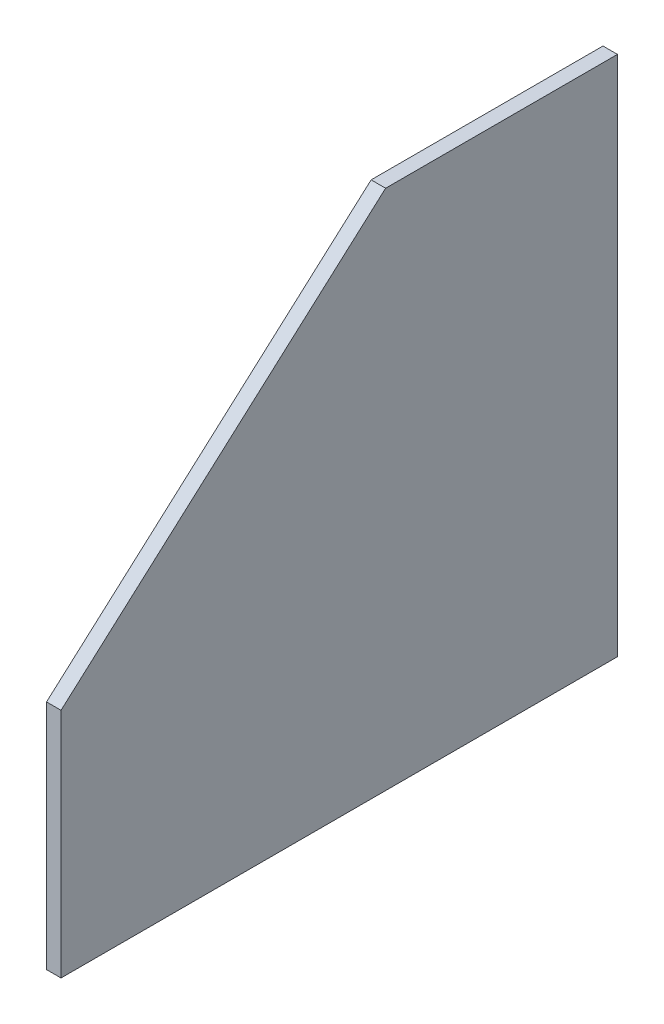
ISO-10303-21;
HEADER;
FILE_DESCRIPTION(('STEP AP214'),'2;1');
FILE_NAME('part.step','',(''),(''),'','','');
FILE_SCHEMA(('AUTOMOTIVE_DESIGN { 1 0 10303 214 1 1 1 1 }'));
ENDSEC;
DATA;
#1=APPLICATION_CONTEXT('core data for automotive mechanical design processes');
#2=APPLICATION_PROTOCOL_DEFINITION('international standard','automotive_design',2000,#1);
#3=PRODUCT_CONTEXT('',#1,'mechanical');
#4=PRODUCT('Part','Part','',(#3));
#5=PRODUCT_RELATED_PRODUCT_CATEGORY('part','',(#4));
#6=PRODUCT_DEFINITION_FORMATION('','',#4);
#7=PRODUCT_DEFINITION_CONTEXT('part definition',#1,'design');
#8=PRODUCT_DEFINITION('design','',#6,#7);
#9=PRODUCT_DEFINITION_SHAPE('','',#8);
#10=(LENGTH_UNIT() NAMED_UNIT(*) SI_UNIT(.MILLI.,.METRE.));
#11=(NAMED_UNIT(*) PLANE_ANGLE_UNIT() SI_UNIT($,.RADIAN.));
#12=(NAMED_UNIT(*) SI_UNIT($,.STERADIAN.) SOLID_ANGLE_UNIT());
#13=UNCERTAINTY_MEASURE_WITH_UNIT(LENGTH_MEASURE(1.E-05),#10,'distance_accuracy_value','');
#14=(GEOMETRIC_REPRESENTATION_CONTEXT(3) GLOBAL_UNCERTAINTY_ASSIGNED_CONTEXT((#13)) GLOBAL_UNIT_ASSIGNED_CONTEXT((#10,
#11,#12)) REPRESENTATION_CONTEXT('',''));
#15=CARTESIAN_POINT('',(0.,0.,0.));
#16=DIRECTION('',(0.,0.,1.));
#17=DIRECTION('',(1.,0.,0.));
#18=AXIS2_PLACEMENT_3D('',#15,#16,#17);
#19=CARTESIAN_POINT('',(3.175,0.,121.92));
#20=DIRECTION('',(0.,1.,0.));
#21=DIRECTION('',(0.,0.,1.));
#22=AXIS2_PLACEMENT_3D('',#19,#20,#21);
#23=PLANE('',#22);
#24=DIRECTION('',(0.,0.,-1.));
#25=VECTOR('',#24,1.);
#26=CARTESIAN_POINT('',(0.,0.,121.92));
#27=LINE('',#26,#25);
#28=CARTESIAN_POINT('',(0.,0.,121.92));
#29=VERTEX_POINT('',#28);
#30=CARTESIAN_POINT('',(0.,0.,0.));
#31=VERTEX_POINT('',#30);
#32=EDGE_CURVE('E113',#29,#31,#27,.T.);
#33=ORIENTED_EDGE('',*,*,#32,.T.);
#34=DIRECTION('',(-1.,0.,0.));
#35=VECTOR('',#34,1.);
#36=CARTESIAN_POINT('',(3.175,0.,0.));
#37=LINE('',#36,#35);
#38=CARTESIAN_POINT('',(3.175,0.,0.));
#39=VERTEX_POINT('',#38);
#40=EDGE_CURVE('E11',#39,#31,#37,.T.);
#41=ORIENTED_EDGE('',*,*,#40,.F.);
#42=DIRECTION('',(0.,0.,-1.));
#43=VECTOR('',#42,1.);
#44=CARTESIAN_POINT('',(3.175,0.,121.92));
#45=LINE('',#44,#43);
#46=CARTESIAN_POINT('',(3.175,0.,121.92));
#47=VERTEX_POINT('',#46);
#48=EDGE_CURVE('E121',#47,#39,#45,.T.);
#49=ORIENTED_EDGE('',*,*,#48,.F.);
#50=DIRECTION('',(-1.,0.,0.));
#51=VECTOR('',#50,1.);
#52=CARTESIAN_POINT('',(3.175,0.,121.92));
#53=LINE('',#52,#51);
#54=EDGE_CURVE('E109',#47,#29,#53,.T.);
#55=ORIENTED_EDGE('',*,*,#54,.T.);
#56=EDGE_LOOP('',(#33,#41,#49,#55));
#57=FACE_BOUND('',#56,.T.);
#58=ADVANCED_FACE('F39',(#57),#23,.F.);
#59=CARTESIAN_POINT('',(3.175,0.,0.));
#60=DIRECTION('',(0.,0.,1.));
#61=DIRECTION('',(1.,0.,0.));
#62=AXIS2_PLACEMENT_3D('',#59,#60,#61);
#63=PLANE('',#62);
#64=DIRECTION('',(0.,1.,0.));
#65=VECTOR('',#64,1.);
#66=CARTESIAN_POINT('',(0.,0.,0.));
#67=LINE('',#66,#65);
#68=CARTESIAN_POINT('',(0.,114.3,0.));
#69=VERTEX_POINT('',#68);
#70=EDGE_CURVE('E116',#31,#69,#67,.T.);
#71=ORIENTED_EDGE('',*,*,#70,.T.);
#72=DIRECTION('',(-1.,0.,0.));
#73=VECTOR('',#72,1.);
#74=CARTESIAN_POINT('',(3.175,114.3,0.));
#75=LINE('',#74,#73);
#76=CARTESIAN_POINT('',(3.175,114.3,0.));
#77=VERTEX_POINT('',#76);
#78=EDGE_CURVE('E47',#77,#69,#75,.T.);
#79=ORIENTED_EDGE('',*,*,#78,.F.);
#80=DIRECTION('',(0.,1.,0.));
#81=VECTOR('',#80,1.);
#82=CARTESIAN_POINT('',(3.175,0.,0.));
#83=LINE('',#82,#81);
#84=EDGE_CURVE('E89',#39,#77,#83,.T.);
#85=ORIENTED_EDGE('',*,*,#84,.F.);
#86=ORIENTED_EDGE('',*,*,#40,.T.);
#87=EDGE_LOOP('',(#71,#79,#85,#86));
#88=FACE_BOUND('',#87,.T.);
#89=ADVANCED_FACE('F140',(#88),#63,.F.);
#90=CARTESIAN_POINT('',(3.175,114.3,0.));
#91=DIRECTION('',(0.,-1.,0.));
#92=DIRECTION('',(0.,0.,-1.));
#93=AXIS2_PLACEMENT_3D('',#90,#91,#92);
#94=PLANE('',#93);
#95=DIRECTION('',(0.,0.,1.));
#96=VECTOR('',#95,1.);
#97=CARTESIAN_POINT('',(0.,114.3,0.));
#98=LINE('',#97,#96);
#99=CARTESIAN_POINT('',(0.,114.3,50.8));
#100=VERTEX_POINT('',#99);
#101=EDGE_CURVE('E104',#69,#100,#98,.T.);
#102=ORIENTED_EDGE('',*,*,#101,.T.);
#103=DIRECTION('',(-1.,0.,0.));
#104=VECTOR('',#103,1.);
#105=CARTESIAN_POINT('',(3.175,114.3,50.8));
#106=LINE('',#105,#104);
#107=CARTESIAN_POINT('',(3.175,114.3,50.8));
#108=VERTEX_POINT('',#107);
#109=EDGE_CURVE('E101',#108,#100,#106,.T.);
#110=ORIENTED_EDGE('',*,*,#109,.F.);
#111=DIRECTION('',(0.,0.,1.));
#112=VECTOR('',#111,1.);
#113=CARTESIAN_POINT('',(3.175,114.3,0.));
#114=LINE('',#113,#112);
#115=EDGE_CURVE('E93',#77,#108,#114,.T.);
#116=ORIENTED_EDGE('',*,*,#115,.F.);
#117=ORIENTED_EDGE('',*,*,#78,.T.);
#118=EDGE_LOOP('',(#102,#110,#116,#117));
#119=FACE_BOUND('',#118,.T.);
#120=ADVANCED_FACE('F102',(#119),#94,.F.);
#121=CARTESIAN_POINT('',(3.175,114.3,50.8));
#122=DIRECTION('',(0.,-0.745937661625915,-0.666015769308852));
#123=DIRECTION('',(0.,0.666015769308853,-0.745937661625915));
#124=AXIS2_PLACEMENT_3D('',#121,#122,#123);
#125=PLANE('',#124);
#126=DIRECTION('',(0.,-0.666015769308853,0.745937661625915));
#127=VECTOR('',#126,1.);
#128=CARTESIAN_POINT('',(0.,114.3,50.8));
#129=LINE('',#128,#127);
#130=CARTESIAN_POINT('',(0.,50.8,121.92));
#131=VERTEX_POINT('',#130);
#132=EDGE_CURVE('E75',#100,#131,#129,.T.);
#133=ORIENTED_EDGE('',*,*,#132,.T.);
#134=DIRECTION('',(-1.,0.,0.));
#135=VECTOR('',#134,1.);
#136=CARTESIAN_POINT('',(3.175,50.8,121.92));
#137=LINE('',#136,#135);
#138=CARTESIAN_POINT('',(3.175,50.8,121.92));
#139=VERTEX_POINT('',#138);
#140=EDGE_CURVE('E105',#139,#131,#137,.T.);
#141=ORIENTED_EDGE('',*,*,#140,.F.);
#142=DIRECTION('',(0.,-0.666015769308853,0.745937661625915));
#143=VECTOR('',#142,1.);
#144=CARTESIAN_POINT('',(3.175,114.3,50.8));
#145=LINE('',#144,#143);
#146=EDGE_CURVE('E97',#108,#139,#145,.T.);
#147=ORIENTED_EDGE('',*,*,#146,.F.);
#148=ORIENTED_EDGE('',*,*,#109,.T.);
#149=EDGE_LOOP('',(#133,#141,#147,#148));
#150=FACE_BOUND('',#149,.T.);
#151=ADVANCED_FACE('F107',(#150),#125,.F.);
#152=CARTESIAN_POINT('',(3.175,50.8,121.92));
#153=DIRECTION('',(0.,0.,-1.));
#154=DIRECTION('',(-1.,0.,0.));
#155=AXIS2_PLACEMENT_3D('',#152,#153,#154);
#156=PLANE('',#155);
#157=DIRECTION('',(0.,-1.,0.));
#158=VECTOR('',#157,1.);
#159=CARTESIAN_POINT('',(0.,50.8,121.92));
#160=LINE('',#159,#158);
#161=EDGE_CURVE('E81',#131,#29,#160,.T.);
#162=ORIENTED_EDGE('',*,*,#161,.T.);
#163=ORIENTED_EDGE('',*,*,#54,.F.);
#164=DIRECTION('',(0.,-1.,0.));
#165=VECTOR('',#164,1.);
#166=CARTESIAN_POINT('',(3.175,50.8,121.92));
#167=LINE('',#166,#165);
#168=EDGE_CURVE('E55',#139,#47,#167,.T.);
#169=ORIENTED_EDGE('',*,*,#168,.F.);
#170=ORIENTED_EDGE('',*,*,#140,.T.);
#171=EDGE_LOOP('',(#162,#163,#169,#170));
#172=FACE_BOUND('',#171,.T.);
#173=ADVANCED_FACE('F129',(#172),#156,.F.);
#174=CARTESIAN_POINT('',(3.175,0.,0.));
#175=DIRECTION('',(1.,0.,0.));
#176=DIRECTION('',(0.,0.,-1.));
#177=AXIS2_PLACEMENT_3D('',#174,#175,#176);
#178=PLANE('',#177);
#179=ORIENTED_EDGE('',*,*,#48,.T.);
#180=ORIENTED_EDGE('',*,*,#84,.T.);
#181=ORIENTED_EDGE('',*,*,#115,.T.);
#182=ORIENTED_EDGE('',*,*,#146,.T.);
#183=ORIENTED_EDGE('',*,*,#168,.T.);
#184=EDGE_LOOP('',(#179,#180,#181,#182,#183));
#185=FACE_BOUND('',#184,.T.);
#186=ADVANCED_FACE('F95',(#185),#178,.T.);
#187=CARTESIAN_POINT('',(0.,0.,0.));
#188=DIRECTION('',(1.,0.,0.));
#189=DIRECTION('',(0.,0.,-1.));
#190=AXIS2_PLACEMENT_3D('',#187,#188,#189);
#191=PLANE('',#190);
#192=ORIENTED_EDGE('',*,*,#32,.F.);
#193=ORIENTED_EDGE('',*,*,#161,.F.);
#194=ORIENTED_EDGE('',*,*,#132,.F.);
#195=ORIENTED_EDGE('',*,*,#101,.F.);
#196=ORIENTED_EDGE('',*,*,#70,.F.);
#197=EDGE_LOOP('',(#192,#193,#194,#195,#196));
#198=FACE_BOUND('',#197,.T.);
#199=ADVANCED_FACE('F125',(#198),#191,.F.);
#200=CLOSED_SHELL('',(#58,#89,#120,#151,#173,#186,#199));
#201=MANIFOLD_SOLID_BREP('B2',#200);
#202=ADVANCED_BREP_SHAPE_REPRESENTATION('',(#18,#201),#14);
#203=SHAPE_DEFINITION_REPRESENTATION(#9,#202);
ENDSEC;
END-ISO-10303-21;
